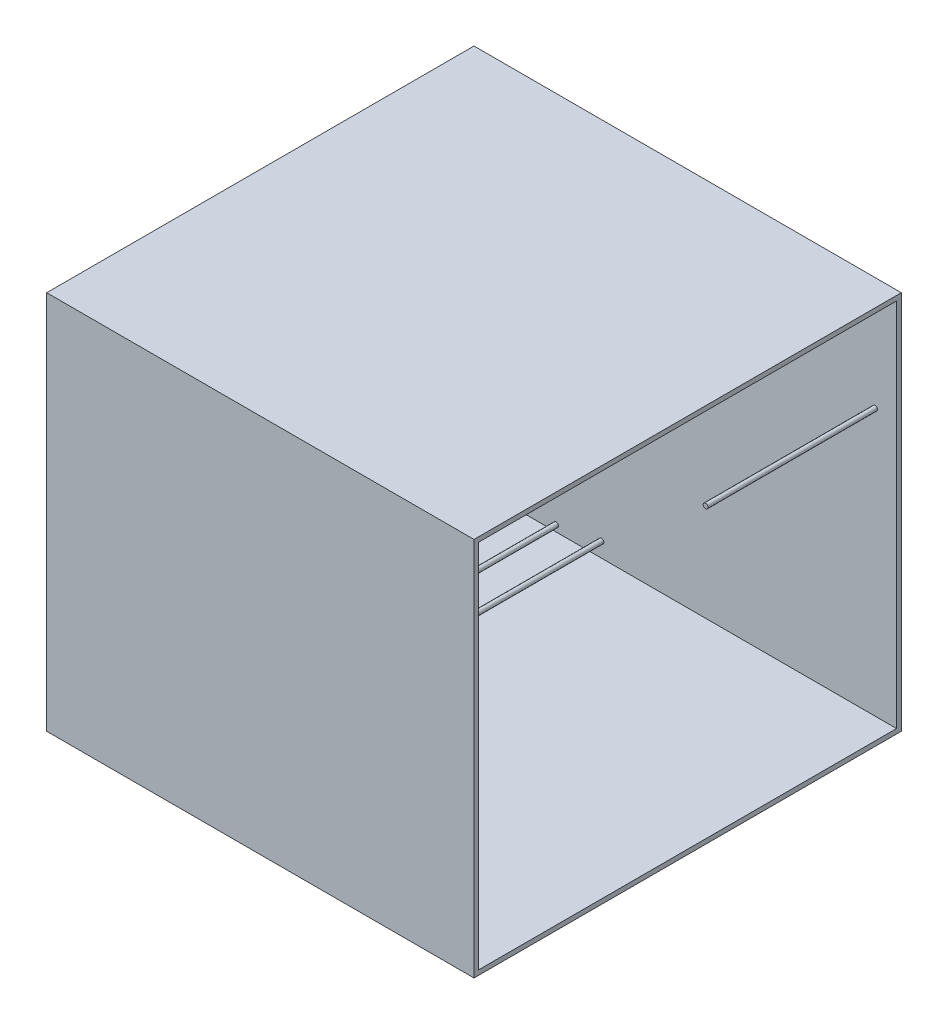
ISO-10303-21;
HEADER;
FILE_DESCRIPTION(('STEP AP214'),'2;1');
FILE_NAME('part.step','',(''),(''),'','','');
FILE_SCHEMA(('AUTOMOTIVE_DESIGN { 1 0 10303 214 1 1 1 1 }'));
ENDSEC;
DATA;
#1=APPLICATION_CONTEXT('core data for automotive mechanical design processes');
#2=APPLICATION_PROTOCOL_DEFINITION('international standard','automotive_design',2000,#1);
#3=PRODUCT_CONTEXT('',#1,'mechanical');
#4=PRODUCT('Part','Part','',(#3));
#5=PRODUCT_RELATED_PRODUCT_CATEGORY('part','',(#4));
#6=PRODUCT_DEFINITION_FORMATION('','',#4);
#7=PRODUCT_DEFINITION_CONTEXT('part definition',#1,'design');
#8=PRODUCT_DEFINITION('design','',#6,#7);
#9=PRODUCT_DEFINITION_SHAPE('','',#8);
#10=(LENGTH_UNIT() NAMED_UNIT(*) SI_UNIT(.MILLI.,.METRE.));
#11=(NAMED_UNIT(*) PLANE_ANGLE_UNIT() SI_UNIT($,.RADIAN.));
#12=(NAMED_UNIT(*) SI_UNIT($,.STERADIAN.) SOLID_ANGLE_UNIT());
#13=UNCERTAINTY_MEASURE_WITH_UNIT(LENGTH_MEASURE(1.E-05),#10,'distance_accuracy_value','');
#14=(GEOMETRIC_REPRESENTATION_CONTEXT(3) GLOBAL_UNCERTAINTY_ASSIGNED_CONTEXT((#13)) GLOBAL_UNIT_ASSIGNED_CONTEXT((#10,
#11,#12)) REPRESENTATION_CONTEXT('',''));
#15=CARTESIAN_POINT('',(0.,0.,0.));
#16=DIRECTION('',(0.,0.,1.));
#17=DIRECTION('',(1.,0.,0.));
#18=AXIS2_PLACEMENT_3D('',#15,#16,#17);
#19=CARTESIAN_POINT('',(450.,0.,0.));
#20=DIRECTION('',(-1.,0.,0.));
#21=DIRECTION('',(0.,0.,1.));
#22=AXIS2_PLACEMENT_3D('',#19,#20,#21);
#23=PLANE('',#22);
#24=DIRECTION('',(0.,-1.,0.));
#25=VECTOR('',#24,1.);
#26=CARTESIAN_POINT('',(450.,0.,0.));
#27=LINE('',#26,#25);
#28=CARTESIAN_POINT('',(450.,400.,0.));
#29=VERTEX_POINT('',#28);
#30=CARTESIAN_POINT('',(450.,0.,0.));
#31=VERTEX_POINT('',#30);
#32=EDGE_CURVE('E150',#29,#31,#27,.T.);
#33=ORIENTED_EDGE('',*,*,#32,.T.);
#34=DIRECTION('',(0.,0.,-1.));
#35=VECTOR('',#34,1.);
#36=CARTESIAN_POINT('',(450.,0.,0.));
#37=LINE('',#36,#35);
#38=CARTESIAN_POINT('',(450.,0.,-450.));
#39=VERTEX_POINT('',#38);
#40=EDGE_CURVE('E153',#31,#39,#37,.T.);
#41=ORIENTED_EDGE('',*,*,#40,.T.);
#42=DIRECTION('',(0.,1.,0.));
#43=VECTOR('',#42,1.);
#44=CARTESIAN_POINT('',(450.,0.,-450.));
#45=LINE('',#44,#43);
#46=CARTESIAN_POINT('',(450.,400.,-450.));
#47=VERTEX_POINT('',#46);
#48=EDGE_CURVE('E156',#39,#47,#45,.T.);
#49=ORIENTED_EDGE('',*,*,#48,.T.);
#50=DIRECTION('',(0.,0.,1.));
#51=VECTOR('',#50,1.);
#52=CARTESIAN_POINT('',(450.,400.,0.));
#53=LINE('',#52,#51);
#54=EDGE_CURVE('E158',#47,#29,#53,.T.);
#55=ORIENTED_EDGE('',*,*,#54,.T.);
#56=EDGE_LOOP('',(#33,#41,#49,#55));
#57=FACE_BOUND('',#56,.T.);
#58=DIRECTION('',(0.,1.,0.));
#59=VECTOR('',#58,1.);
#60=CARTESIAN_POINT('',(450.,5.,-445.));
#61=LINE('',#60,#59);
#62=CARTESIAN_POINT('',(450.,5.,-445.));
#63=VERTEX_POINT('',#62);
#64=CARTESIAN_POINT('',(450.,395.,-445.));
#65=VERTEX_POINT('',#64);
#66=EDGE_CURVE('E112',#63,#65,#61,.T.);
#67=ORIENTED_EDGE('',*,*,#66,.F.);
#68=DIRECTION('',(0.,0.,-1.));
#69=VECTOR('',#68,1.);
#70=CARTESIAN_POINT('',(450.,5.,-5.));
#71=LINE('',#70,#69);
#72=CARTESIAN_POINT('',(450.,5.,-5.));
#73=VERTEX_POINT('',#72);
#74=EDGE_CURVE('E134',#73,#63,#71,.T.);
#75=ORIENTED_EDGE('',*,*,#74,.F.);
#76=DIRECTION('',(0.,-1.,0.));
#77=VECTOR('',#76,1.);
#78=CARTESIAN_POINT('',(450.,5.,-5.));
#79=LINE('',#78,#77);
#80=CARTESIAN_POINT('',(450.,395.,-5.));
#81=VERTEX_POINT('',#80);
#82=EDGE_CURVE('E132',#81,#73,#79,.T.);
#83=ORIENTED_EDGE('',*,*,#82,.F.);
#84=DIRECTION('',(0.,0.,1.));
#85=VECTOR('',#84,1.);
#86=CARTESIAN_POINT('',(450.,395.,-5.));
#87=LINE('',#86,#85);
#88=EDGE_CURVE('E120',#65,#81,#87,.T.);
#89=ORIENTED_EDGE('',*,*,#88,.F.);
#90=EDGE_LOOP('',(#67,#75,#83,#89));
#91=FACE_BOUND('',#90,.T.);
#92=ADVANCED_FACE('F47',(#57,#91),#23,.F.);
#93=CARTESIAN_POINT('',(0.,0.,0.));
#94=DIRECTION('',(-1.,0.,0.));
#95=DIRECTION('',(0.,0.,1.));
#96=AXIS2_PLACEMENT_3D('',#93,#94,#95);
#97=PLANE('',#96);
#98=DIRECTION('',(0.,-1.,0.));
#99=VECTOR('',#98,1.);
#100=CARTESIAN_POINT('',(0.,0.,0.));
#101=LINE('',#100,#99);
#102=CARTESIAN_POINT('',(0.,400.,0.));
#103=VERTEX_POINT('',#102);
#104=CARTESIAN_POINT('',(0.,0.,0.));
#105=VERTEX_POINT('',#104);
#106=EDGE_CURVE('E128',#103,#105,#101,.T.);
#107=ORIENTED_EDGE('',*,*,#106,.F.);
#108=DIRECTION('',(0.,0.,1.));
#109=VECTOR('',#108,1.);
#110=CARTESIAN_POINT('',(0.,400.,0.));
#111=LINE('',#110,#109);
#112=CARTESIAN_POINT('',(0.,400.,-450.));
#113=VERTEX_POINT('',#112);
#114=EDGE_CURVE('E154',#113,#103,#111,.T.);
#115=ORIENTED_EDGE('',*,*,#114,.F.);
#116=DIRECTION('',(0.,1.,0.));
#117=VECTOR('',#116,1.);
#118=CARTESIAN_POINT('',(0.,0.,-450.));
#119=LINE('',#118,#117);
#120=CARTESIAN_POINT('',(0.,0.,-450.));
#121=VERTEX_POINT('',#120);
#122=EDGE_CURVE('E165',#121,#113,#119,.T.);
#123=ORIENTED_EDGE('',*,*,#122,.F.);
#124=DIRECTION('',(0.,0.,-1.));
#125=VECTOR('',#124,1.);
#126=CARTESIAN_POINT('',(0.,0.,0.));
#127=LINE('',#126,#125);
#128=EDGE_CURVE('E163',#105,#121,#127,.T.);
#129=ORIENTED_EDGE('',*,*,#128,.F.);
#130=EDGE_LOOP('',(#107,#115,#123,#129));
#131=FACE_BOUND('',#130,.T.);
#132=DIRECTION('',(0.,0.,-1.));
#133=VECTOR('',#132,1.);
#134=CARTESIAN_POINT('',(0.,5.,-5.));
#135=LINE('',#134,#133);
#136=CARTESIAN_POINT('',(0.,5.,-5.));
#137=VERTEX_POINT('',#136);
#138=CARTESIAN_POINT('',(0.,5.,-445.));
#139=VERTEX_POINT('',#138);
#140=EDGE_CURVE('E121',#137,#139,#135,.T.);
#141=ORIENTED_EDGE('',*,*,#140,.T.);
#142=DIRECTION('',(0.,1.,0.));
#143=VECTOR('',#142,1.);
#144=CARTESIAN_POINT('',(0.,5.,-445.));
#145=LINE('',#144,#143);
#146=CARTESIAN_POINT('',(0.,395.,-445.));
#147=VERTEX_POINT('',#146);
#148=EDGE_CURVE('E70',#139,#147,#145,.T.);
#149=ORIENTED_EDGE('',*,*,#148,.T.);
#150=DIRECTION('',(0.,0.,1.));
#151=VECTOR('',#150,1.);
#152=CARTESIAN_POINT('',(0.,395.,-5.));
#153=LINE('',#152,#151);
#154=CARTESIAN_POINT('',(0.,395.,-5.));
#155=VERTEX_POINT('',#154);
#156=EDGE_CURVE('E127',#147,#155,#153,.T.);
#157=ORIENTED_EDGE('',*,*,#156,.T.);
#158=DIRECTION('',(0.,-1.,0.));
#159=VECTOR('',#158,1.);
#160=CARTESIAN_POINT('',(0.,5.,-5.));
#161=LINE('',#160,#159);
#162=EDGE_CURVE('E142',#155,#137,#161,.T.);
#163=ORIENTED_EDGE('',*,*,#162,.T.);
#164=EDGE_LOOP('',(#141,#149,#157,#163));
#165=FACE_BOUND('',#164,.T.);
#166=ADVANCED_FACE('F245',(#131,#165),#97,.T.);
#167=CARTESIAN_POINT('',(450.,0.,0.));
#168=DIRECTION('',(0.,0.,-1.));
#169=DIRECTION('',(-1.,0.,0.));
#170=AXIS2_PLACEMENT_3D('',#167,#168,#169);
#171=PLANE('',#170);
#172=ORIENTED_EDGE('',*,*,#106,.T.);
#173=DIRECTION('',(-1.,0.,0.));
#174=VECTOR('',#173,1.);
#175=CARTESIAN_POINT('',(450.,0.,0.));
#176=LINE('',#175,#174);
#177=EDGE_CURVE('E176',#31,#105,#176,.T.);
#178=ORIENTED_EDGE('',*,*,#177,.F.);
#179=ORIENTED_EDGE('',*,*,#32,.F.);
#180=DIRECTION('',(-1.,0.,0.));
#181=VECTOR('',#180,1.);
#182=CARTESIAN_POINT('',(450.,400.,0.));
#183=LINE('',#182,#181);
#184=EDGE_CURVE('E160',#29,#103,#183,.T.);
#185=ORIENTED_EDGE('',*,*,#184,.T.);
#186=EDGE_LOOP('',(#172,#178,#179,#185));
#187=FACE_BOUND('',#186,.T.);
#188=ADVANCED_FACE('F49',(#187),#171,.F.);
#189=CARTESIAN_POINT('',(450.,0.,0.));
#190=DIRECTION('',(0.,1.,0.));
#191=DIRECTION('',(0.,0.,1.));
#192=AXIS2_PLACEMENT_3D('',#189,#190,#191);
#193=PLANE('',#192);
#194=ORIENTED_EDGE('',*,*,#128,.T.);
#195=DIRECTION('',(-1.,0.,0.));
#196=VECTOR('',#195,1.);
#197=CARTESIAN_POINT('',(450.,0.,-450.));
#198=LINE('',#197,#196);
#199=EDGE_CURVE('E173',#39,#121,#198,.T.);
#200=ORIENTED_EDGE('',*,*,#199,.F.);
#201=ORIENTED_EDGE('',*,*,#40,.F.);
#202=ORIENTED_EDGE('',*,*,#177,.T.);
#203=EDGE_LOOP('',(#194,#200,#201,#202));
#204=FACE_BOUND('',#203,.T.);
#205=ADVANCED_FACE('F260',(#204),#193,.F.);
#206=CARTESIAN_POINT('',(450.,0.,-450.));
#207=DIRECTION('',(0.,0.,1.));
#208=DIRECTION('',(1.,0.,0.));
#209=AXIS2_PLACEMENT_3D('',#206,#207,#208);
#210=PLANE('',#209);
#211=ORIENTED_EDGE('',*,*,#122,.T.);
#212=DIRECTION('',(-1.,0.,0.));
#213=VECTOR('',#212,1.);
#214=CARTESIAN_POINT('',(450.,400.,-450.));
#215=LINE('',#214,#213);
#216=EDGE_CURVE('E170',#47,#113,#215,.T.);
#217=ORIENTED_EDGE('',*,*,#216,.F.);
#218=ORIENTED_EDGE('',*,*,#48,.F.);
#219=ORIENTED_EDGE('',*,*,#199,.T.);
#220=EDGE_LOOP('',(#211,#217,#218,#219));
#221=FACE_BOUND('',#220,.T.);
#222=ADVANCED_FACE('F257',(#221),#210,.F.);
#223=CARTESIAN_POINT('',(450.,400.,0.));
#224=DIRECTION('',(0.,-1.,0.));
#225=DIRECTION('',(0.,0.,-1.));
#226=AXIS2_PLACEMENT_3D('',#223,#224,#225);
#227=PLANE('',#226);
#228=ORIENTED_EDGE('',*,*,#114,.T.);
#229=ORIENTED_EDGE('',*,*,#184,.F.);
#230=ORIENTED_EDGE('',*,*,#54,.F.);
#231=ORIENTED_EDGE('',*,*,#216,.T.);
#232=EDGE_LOOP('',(#228,#229,#230,#231));
#233=FACE_BOUND('',#232,.T.);
#234=ADVANCED_FACE('F198',(#233),#227,.F.);
#235=CARTESIAN_POINT('',(450.,5.,-445.));
#236=DIRECTION('',(0.,0.,1.));
#237=DIRECTION('',(1.,0.,0.));
#238=AXIS2_PLACEMENT_3D('',#235,#236,#237);
#239=PLANE('',#238);
#240=CARTESIAN_POINT('',(150.03,199.95,-445.));
#241=DIRECTION('',(0.,0.,1.));
#242=DIRECTION('',(1.,0.,0.));
#243=AXIS2_PLACEMENT_3D('',#240,#241,#242);
#244=CIRCLE('',#243,7.50000000000001);
#245=CARTESIAN_POINT('',(157.53,199.95,-445.));
#246=VERTEX_POINT('',#245);
#247=EDGE_CURVE('E11',#246,#246,#244,.T.);
#248=ORIENTED_EDGE('',*,*,#247,.F.);
#249=EDGE_LOOP('',(#248));
#250=FACE_BOUND('',#249,.T.);
#251=CARTESIAN_POINT('',(353.49,348.09,-445.));
#252=DIRECTION('',(0.,0.,1.));
#253=DIRECTION('',(1.,0.,0.));
#254=AXIS2_PLACEMENT_3D('',#251,#252,#253);
#255=CIRCLE('',#254,2.50000000000002);
#256=CARTESIAN_POINT('',(355.99,348.09,-445.));
#257=VERTEX_POINT('',#256);
#258=EDGE_CURVE('E55',#257,#257,#255,.T.);
#259=ORIENTED_EDGE('',*,*,#258,.F.);
#260=EDGE_LOOP('',(#259));
#261=FACE_BOUND('',#260,.T.);
#262=CARTESIAN_POINT('',(427.35,285.92,-445.));
#263=DIRECTION('',(0.,0.,1.));
#264=DIRECTION('',(1.,0.,0.));
#265=AXIS2_PLACEMENT_3D('',#262,#263,#264);
#266=CIRCLE('',#265,2.50000000000002);
#267=CARTESIAN_POINT('',(429.85,285.92,-445.));
#268=VERTEX_POINT('',#267);
#269=EDGE_CURVE('E188',#268,#268,#266,.T.);
#270=ORIENTED_EDGE('',*,*,#269,.F.);
#271=EDGE_LOOP('',(#270));
#272=FACE_BOUND('',#271,.T.);
#273=ORIENTED_EDGE('',*,*,#148,.F.);
#274=DIRECTION('',(-1.,0.,0.));
#275=VECTOR('',#274,1.);
#276=CARTESIAN_POINT('',(450.,5.,-445.));
#277=LINE('',#276,#275);
#278=EDGE_CURVE('E116',#63,#139,#277,.T.);
#279=ORIENTED_EDGE('',*,*,#278,.F.);
#280=ORIENTED_EDGE('',*,*,#66,.T.);
#281=DIRECTION('',(-1.,0.,0.));
#282=VECTOR('',#281,1.);
#283=CARTESIAN_POINT('',(450.,395.,-445.));
#284=LINE('',#283,#282);
#285=EDGE_CURVE('E115',#65,#147,#284,.T.);
#286=ORIENTED_EDGE('',*,*,#285,.T.);
#287=EDGE_LOOP('',(#273,#279,#280,#286));
#288=FACE_BOUND('',#287,.T.);
#289=ADVANCED_FACE('F114',(#250,#261,#272,#288),#239,.T.);
#290=CARTESIAN_POINT('',(450.,395.,-5.));
#291=DIRECTION('',(0.,-1.,0.));
#292=DIRECTION('',(0.,0.,-1.));
#293=AXIS2_PLACEMENT_3D('',#290,#291,#292);
#294=PLANE('',#293);
#295=ORIENTED_EDGE('',*,*,#156,.F.);
#296=ORIENTED_EDGE('',*,*,#285,.F.);
#297=ORIENTED_EDGE('',*,*,#88,.T.);
#298=DIRECTION('',(-1.,0.,0.));
#299=VECTOR('',#298,1.);
#300=CARTESIAN_POINT('',(450.,395.,-5.));
#301=LINE('',#300,#299);
#302=EDGE_CURVE('E129',#81,#155,#301,.T.);
#303=ORIENTED_EDGE('',*,*,#302,.T.);
#304=EDGE_LOOP('',(#295,#296,#297,#303));
#305=FACE_BOUND('',#304,.T.);
#306=ADVANCED_FACE('F124',(#305),#294,.T.);
#307=CARTESIAN_POINT('',(450.,5.,-5.));
#308=DIRECTION('',(0.,0.,-1.));
#309=DIRECTION('',(0.,1.,0.));
#310=AXIS2_PLACEMENT_3D('',#307,#308,#309);
#311=PLANE('',#310);
#312=CARTESIAN_POINT('',(150.03,199.95,-5.));
#313=DIRECTION('',(0.,0.,-1.));
#314=DIRECTION('',(0.,1.,0.));
#315=AXIS2_PLACEMENT_3D('',#312,#313,#314);
#316=CIRCLE('',#315,7.50000000000001);
#317=CARTESIAN_POINT('',(150.03,207.45,-5.));
#318=VERTEX_POINT('',#317);
#319=EDGE_CURVE('E185',#318,#318,#316,.T.);
#320=ORIENTED_EDGE('',*,*,#319,.F.);
#321=EDGE_LOOP('',(#320));
#322=FACE_BOUND('',#321,.T.);
#323=CARTESIAN_POINT('',(347.87,268.16,-5.));
#324=DIRECTION('',(0.,0.,-1.));
#325=DIRECTION('',(0.,1.,0.));
#326=AXIS2_PLACEMENT_3D('',#323,#324,#325);
#327=CIRCLE('',#326,2.50000000000002);
#328=CARTESIAN_POINT('',(347.87,270.66,-5.));
#329=VERTEX_POINT('',#328);
#330=EDGE_CURVE('E182',#329,#329,#327,.T.);
#331=ORIENTED_EDGE('',*,*,#330,.F.);
#332=EDGE_LOOP('',(#331));
#333=FACE_BOUND('',#332,.T.);
#334=CARTESIAN_POINT('',(400.68,282.17,-5.));
#335=DIRECTION('',(0.,0.,-1.));
#336=DIRECTION('',(0.,1.,0.));
#337=AXIS2_PLACEMENT_3D('',#334,#335,#336);
#338=CIRCLE('',#337,2.50000000000002);
#339=CARTESIAN_POINT('',(400.68,284.67,-5.));
#340=VERTEX_POINT('',#339);
#341=EDGE_CURVE('E179',#340,#340,#338,.T.);
#342=ORIENTED_EDGE('',*,*,#341,.F.);
#343=EDGE_LOOP('',(#342));
#344=FACE_BOUND('',#343,.T.);
#345=ORIENTED_EDGE('',*,*,#162,.F.);
#346=ORIENTED_EDGE('',*,*,#302,.F.);
#347=ORIENTED_EDGE('',*,*,#82,.T.);
#348=DIRECTION('',(-1.,0.,0.));
#349=VECTOR('',#348,1.);
#350=CARTESIAN_POINT('',(450.,5.,-5.));
#351=LINE('',#350,#349);
#352=EDGE_CURVE('E62',#73,#137,#351,.T.);
#353=ORIENTED_EDGE('',*,*,#352,.T.);
#354=EDGE_LOOP('',(#345,#346,#347,#353));
#355=FACE_BOUND('',#354,.T.);
#356=ADVANCED_FACE('F281',(#322,#333,#344,#355),#311,.T.);
#357=CARTESIAN_POINT('',(450.,5.,-5.));
#358=DIRECTION('',(0.,1.,0.));
#359=DIRECTION('',(0.,0.,1.));
#360=AXIS2_PLACEMENT_3D('',#357,#358,#359);
#361=PLANE('',#360);
#362=ORIENTED_EDGE('',*,*,#140,.F.);
#363=ORIENTED_EDGE('',*,*,#352,.F.);
#364=ORIENTED_EDGE('',*,*,#74,.T.);
#365=ORIENTED_EDGE('',*,*,#278,.T.);
#366=EDGE_LOOP('',(#362,#363,#364,#365));
#367=FACE_BOUND('',#366,.T.);
#368=ADVANCED_FACE('F241',(#367),#361,.T.);
#369=CARTESIAN_POINT('',(400.68,282.17,-183.55));
#370=DIRECTION('',(0.,0.,1.));
#371=DIRECTION('',(1.,0.,0.));
#372=AXIS2_PLACEMENT_3D('',#369,#370,#371);
#373=CYLINDRICAL_SURFACE('',#372,2.50000000000002);
#374=ORIENTED_EDGE('',*,*,#341,.T.);
#375=EDGE_LOOP('',(#374));
#376=FACE_BOUND('',#375,.T.);
#377=CARTESIAN_POINT('',(400.68,282.17,-183.55));
#378=DIRECTION('',(0.,0.,1.));
#379=DIRECTION('',(1.,0.,0.));
#380=AXIS2_PLACEMENT_3D('',#377,#378,#379);
#381=CIRCLE('',#380,2.50000000000002);
#382=CARTESIAN_POINT('',(403.18,282.17,-183.55));
#383=VERTEX_POINT('',#382);
#384=EDGE_CURVE('E140',#383,#383,#381,.T.);
#385=ORIENTED_EDGE('',*,*,#384,.T.);
#386=EDGE_LOOP('',(#385));
#387=FACE_BOUND('',#386,.T.);
#388=ADVANCED_FACE('F228',(#376,#387),#373,.T.);
#389=CARTESIAN_POINT('',(0.,0.,-183.55));
#390=DIRECTION('',(0.,0.,1.));
#391=DIRECTION('',(1.,0.,0.));
#392=AXIS2_PLACEMENT_3D('',#389,#390,#391);
#393=PLANE('',#392);
#394=ORIENTED_EDGE('',*,*,#384,.F.);
#395=EDGE_LOOP('',(#394));
#396=FACE_BOUND('',#395,.T.);
#397=ADVANCED_FACE('F230',(#396),#393,.F.);
#398=CARTESIAN_POINT('',(347.87,268.16,-188.55));
#399=DIRECTION('',(0.,0.,1.));
#400=DIRECTION('',(1.,0.,0.));
#401=AXIS2_PLACEMENT_3D('',#398,#399,#400);
#402=CYLINDRICAL_SURFACE('',#401,2.50000000000002);
#403=ORIENTED_EDGE('',*,*,#330,.T.);
#404=EDGE_LOOP('',(#403));
#405=FACE_BOUND('',#404,.T.);
#406=CARTESIAN_POINT('',(347.87,268.16,-188.55));
#407=DIRECTION('',(0.,0.,1.));
#408=DIRECTION('',(1.,0.,0.));
#409=AXIS2_PLACEMENT_3D('',#406,#407,#408);
#410=CIRCLE('',#409,2.50000000000002);
#411=CARTESIAN_POINT('',(350.37,268.16,-188.55));
#412=VERTEX_POINT('',#411);
#413=EDGE_CURVE('E217',#412,#412,#410,.T.);
#414=ORIENTED_EDGE('',*,*,#413,.T.);
#415=EDGE_LOOP('',(#414));
#416=FACE_BOUND('',#415,.T.);
#417=ADVANCED_FACE('F232',(#405,#416),#402,.T.);
#418=CARTESIAN_POINT('',(347.87,268.16,-188.55));
#419=DIRECTION('',(0.,0.,1.));
#420=DIRECTION('',(1.,0.,0.));
#421=AXIS2_PLACEMENT_3D('',#418,#419,#420);
#422=PLANE('',#421);
#423=ORIENTED_EDGE('',*,*,#413,.F.);
#424=EDGE_LOOP('',(#423));
#425=FACE_BOUND('',#424,.T.);
#426=ADVANCED_FACE('F238',(#425),#422,.F.);
#427=CARTESIAN_POINT('',(150.03,199.95,-181.55));
#428=DIRECTION('',(0.,0.,1.));
#429=DIRECTION('',(1.,0.,0.));
#430=AXIS2_PLACEMENT_3D('',#427,#428,#429);
#431=CYLINDRICAL_SURFACE('',#430,7.50000000000001);
#432=ORIENTED_EDGE('',*,*,#319,.T.);
#433=EDGE_LOOP('',(#432));
#434=FACE_BOUND('',#433,.T.);
#435=CARTESIAN_POINT('',(150.03,199.95,-181.55));
#436=DIRECTION('',(0.,0.,1.));
#437=DIRECTION('',(1.,0.,0.));
#438=AXIS2_PLACEMENT_3D('',#435,#436,#437);
#439=CIRCLE('',#438,7.50000000000001);
#440=CARTESIAN_POINT('',(157.53,199.95,-181.55));
#441=VERTEX_POINT('',#440);
#442=EDGE_CURVE('E213',#441,#441,#439,.T.);
#443=ORIENTED_EDGE('',*,*,#442,.T.);
#444=EDGE_LOOP('',(#443));
#445=FACE_BOUND('',#444,.T.);
#446=ADVANCED_FACE('F309',(#434,#445),#431,.T.);
#447=CARTESIAN_POINT('',(150.03,199.95,-181.55));
#448=DIRECTION('',(0.,0.,1.));
#449=DIRECTION('',(1.,0.,0.));
#450=AXIS2_PLACEMENT_3D('',#447,#448,#449);
#451=PLANE('',#450);
#452=ORIENTED_EDGE('',*,*,#442,.F.);
#453=EDGE_LOOP('',(#452));
#454=FACE_BOUND('',#453,.T.);
#455=ADVANCED_FACE('F207',(#454),#451,.F.);
#456=CARTESIAN_POINT('',(427.35,285.92,-266.55));
#457=DIRECTION('',(0.,0.,-1.));
#458=DIRECTION('',(-1.,0.,0.));
#459=AXIS2_PLACEMENT_3D('',#456,#457,#458);
#460=CYLINDRICAL_SURFACE('',#459,2.50000000000002);
#461=ORIENTED_EDGE('',*,*,#269,.T.);
#462=EDGE_LOOP('',(#461));
#463=FACE_BOUND('',#462,.T.);
#464=CARTESIAN_POINT('',(427.35,285.92,-266.55));
#465=DIRECTION('',(0.,0.,-1.));
#466=DIRECTION('',(-1.,0.,0.));
#467=AXIS2_PLACEMENT_3D('',#464,#465,#466);
#468=CIRCLE('',#467,2.50000000000002);
#469=CARTESIAN_POINT('',(424.85,285.92,-266.55));
#470=VERTEX_POINT('',#469);
#471=EDGE_CURVE('E211',#470,#470,#468,.T.);
#472=ORIENTED_EDGE('',*,*,#471,.T.);
#473=EDGE_LOOP('',(#472));
#474=FACE_BOUND('',#473,.T.);
#475=ADVANCED_FACE('F203',(#463,#474),#460,.T.);
#476=CARTESIAN_POINT('',(427.35,285.92,-266.55));
#477=DIRECTION('',(0.,0.,-1.));
#478=DIRECTION('',(-1.,0.,0.));
#479=AXIS2_PLACEMENT_3D('',#476,#477,#478);
#480=PLANE('',#479);
#481=ORIENTED_EDGE('',*,*,#471,.F.);
#482=EDGE_LOOP('',(#481));
#483=FACE_BOUND('',#482,.T.);
#484=ADVANCED_FACE('F206',(#483),#480,.F.);
#485=CARTESIAN_POINT('',(353.49,348.09,-266.55));
#486=DIRECTION('',(0.,0.,-1.));
#487=DIRECTION('',(-1.,0.,0.));
#488=AXIS2_PLACEMENT_3D('',#485,#486,#487);
#489=CYLINDRICAL_SURFACE('',#488,2.50000000000002);
#490=ORIENTED_EDGE('',*,*,#258,.T.);
#491=EDGE_LOOP('',(#490));
#492=FACE_BOUND('',#491,.T.);
#493=CARTESIAN_POINT('',(353.49,348.09,-266.55));
#494=DIRECTION('',(0.,0.,-1.));
#495=DIRECTION('',(-1.,0.,0.));
#496=AXIS2_PLACEMENT_3D('',#493,#494,#495);
#497=CIRCLE('',#496,2.50000000000002);
#498=CARTESIAN_POINT('',(350.99,348.09,-266.55));
#499=VERTEX_POINT('',#498);
#500=EDGE_CURVE('E214',#499,#499,#497,.T.);
#501=ORIENTED_EDGE('',*,*,#500,.T.);
#502=EDGE_LOOP('',(#501));
#503=FACE_BOUND('',#502,.T.);
#504=ADVANCED_FACE('F193',(#492,#503),#489,.T.);
#505=CARTESIAN_POINT('',(353.49,348.09,-266.55));
#506=DIRECTION('',(0.,0.,-1.));
#507=DIRECTION('',(-1.,0.,0.));
#508=AXIS2_PLACEMENT_3D('',#505,#506,#507);
#509=PLANE('',#508);
#510=ORIENTED_EDGE('',*,*,#500,.F.);
#511=EDGE_LOOP('',(#510));
#512=FACE_BOUND('',#511,.T.);
#513=ADVANCED_FACE('F352',(#512),#509,.F.);
#514=CARTESIAN_POINT('',(150.03,199.95,-329.55));
#515=DIRECTION('',(0.,0.,-1.));
#516=DIRECTION('',(-1.,0.,0.));
#517=AXIS2_PLACEMENT_3D('',#514,#515,#516);
#518=CYLINDRICAL_SURFACE('',#517,7.50000000000001);
#519=ORIENTED_EDGE('',*,*,#247,.T.);
#520=EDGE_LOOP('',(#519));
#521=FACE_BOUND('',#520,.T.);
#522=CARTESIAN_POINT('',(150.03,199.95,-329.55));
#523=DIRECTION('',(0.,0.,-1.));
#524=DIRECTION('',(-1.,0.,0.));
#525=AXIS2_PLACEMENT_3D('',#522,#523,#524);
#526=CIRCLE('',#525,7.50000000000001);
#527=CARTESIAN_POINT('',(142.53,199.95,-329.55));
#528=VERTEX_POINT('',#527);
#529=EDGE_CURVE('E220',#528,#528,#526,.T.);
#530=ORIENTED_EDGE('',*,*,#529,.T.);
#531=EDGE_LOOP('',(#530));
#532=FACE_BOUND('',#531,.T.);
#533=ADVANCED_FACE('F362',(#521,#532),#518,.T.);
#534=CARTESIAN_POINT('',(150.03,199.95,-329.55));
#535=DIRECTION('',(0.,0.,-1.));
#536=DIRECTION('',(-1.,0.,0.));
#537=AXIS2_PLACEMENT_3D('',#534,#535,#536);
#538=PLANE('',#537);
#539=ORIENTED_EDGE('',*,*,#529,.F.);
#540=EDGE_LOOP('',(#539));
#541=FACE_BOUND('',#540,.T.);
#542=ADVANCED_FACE('F387',(#541),#538,.F.);
#543=CLOSED_SHELL('',(#92,#166,#188,#205,#222,#234,#289,#306,#356,#368,#388,#397,#417,#426,#446,
#455,#475,#484,#504,#513,#533,#542));
#544=MANIFOLD_SOLID_BREP('B2',#543);
#545=ADVANCED_BREP_SHAPE_REPRESENTATION('',(#18,#544),#14);
#546=SHAPE_DEFINITION_REPRESENTATION(#9,#545);
ENDSEC;
END-ISO-10303-21;
